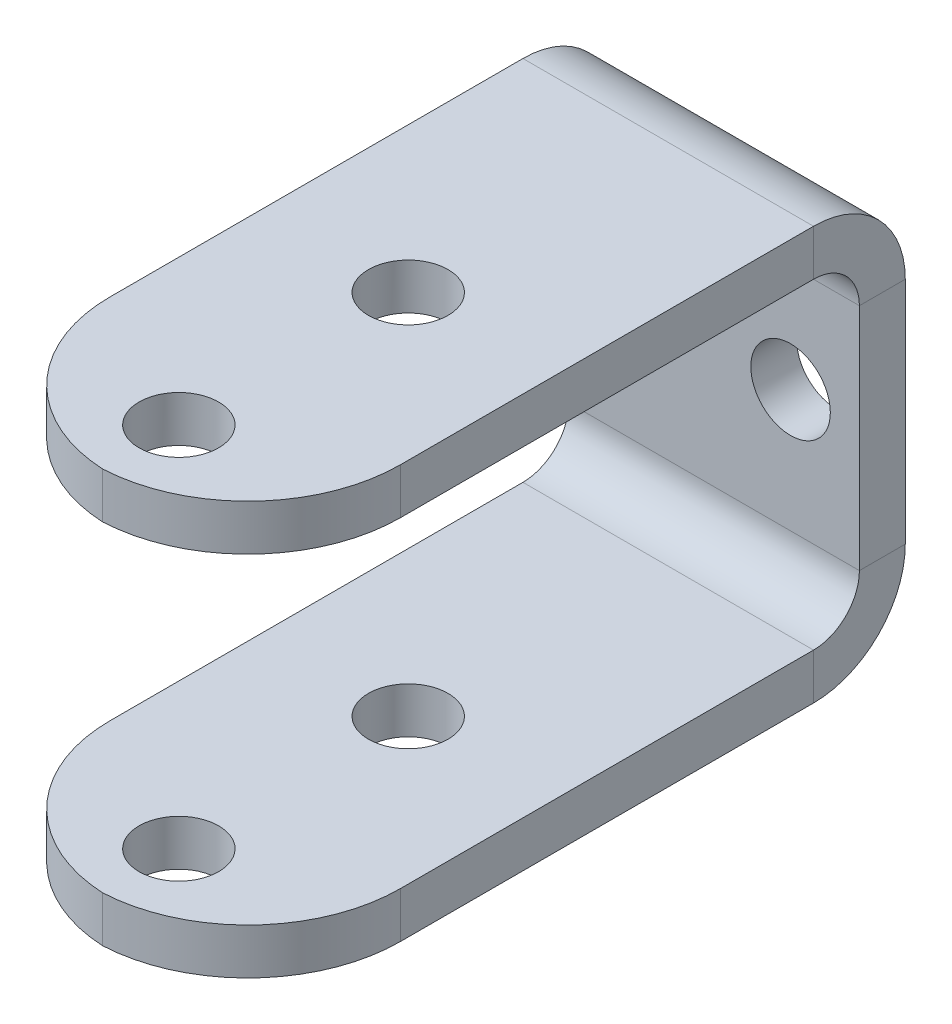
ISO-10303-21;
HEADER;
FILE_DESCRIPTION(('STEP AP214'),'2;1');
FILE_NAME('part.step','',(''),(''),'','','');
FILE_SCHEMA(('AUTOMOTIVE_DESIGN { 1 0 10303 214 1 1 1 1 }'));
ENDSEC;
DATA;
#1=APPLICATION_CONTEXT('core data for automotive mechanical design processes');
#2=APPLICATION_PROTOCOL_DEFINITION('international standard','automotive_design',2000,#1);
#3=PRODUCT_CONTEXT('',#1,'mechanical');
#4=PRODUCT('Part','Part','',(#3));
#5=PRODUCT_RELATED_PRODUCT_CATEGORY('part','',(#4));
#6=PRODUCT_DEFINITION_FORMATION('','',#4);
#7=PRODUCT_DEFINITION_CONTEXT('part definition',#1,'design');
#8=PRODUCT_DEFINITION('design','',#6,#7);
#9=PRODUCT_DEFINITION_SHAPE('','',#8);
#10=(LENGTH_UNIT() NAMED_UNIT(*) SI_UNIT(.MILLI.,.METRE.));
#11=(NAMED_UNIT(*) PLANE_ANGLE_UNIT() SI_UNIT($,.RADIAN.));
#12=(NAMED_UNIT(*) SI_UNIT($,.STERADIAN.) SOLID_ANGLE_UNIT());
#13=UNCERTAINTY_MEASURE_WITH_UNIT(LENGTH_MEASURE(1.E-05),#10,'distance_accuracy_value','');
#14=(GEOMETRIC_REPRESENTATION_CONTEXT(3) GLOBAL_UNCERTAINTY_ASSIGNED_CONTEXT((#13)) GLOBAL_UNIT_ASSIGNED_CONTEXT((#10,
#11,#12)) REPRESENTATION_CONTEXT('',''));
#15=CARTESIAN_POINT('',(0.,0.,0.));
#16=DIRECTION('',(0.,0.,1.));
#17=DIRECTION('',(1.,0.,0.));
#18=AXIS2_PLACEMENT_3D('',#15,#16,#17);
#19=CARTESIAN_POINT('',(0.,0.,-3.));
#20=DIRECTION('',(0.,0.,-1.));
#21=DIRECTION('',(-1.,0.,0.));
#22=AXIS2_PLACEMENT_3D('',#19,#20,#21);
#23=PLANE('',#22);
#24=CARTESIAN_POINT('',(5.,0.50000000000001,-3.));
#25=DIRECTION('',(0.,0.,-1.));
#26=DIRECTION('',(-1.,0.,0.));
#27=AXIS2_PLACEMENT_3D('',#24,#25,#26);
#28=CIRCLE('',#27,2.6);
#29=CARTESIAN_POINT('',(2.4,0.50000000000001,-3.));
#30=VERTEX_POINT('',#29);
#31=EDGE_CURVE('E220',#30,#30,#28,.T.);
#32=ORIENTED_EDGE('',*,*,#31,.F.);
#33=EDGE_LOOP('',(#32));
#34=FACE_BOUND('',#33,.T.);
#35=CARTESIAN_POINT('',(-5.,0.500000000000009,-3.));
#36=DIRECTION('',(0.,0.,-1.));
#37=DIRECTION('',(-1.,0.,0.));
#38=AXIS2_PLACEMENT_3D('',#35,#36,#37);
#39=CIRCLE('',#38,2.6);
#40=CARTESIAN_POINT('',(-7.6,0.500000000000009,-3.));
#41=VERTEX_POINT('',#40);
#42=EDGE_CURVE('E725',#41,#41,#39,.T.);
#43=ORIENTED_EDGE('',*,*,#42,.F.);
#44=EDGE_LOOP('',(#43));
#45=FACE_BOUND('',#44,.T.);
#46=DIRECTION('',(0.,1.,0.));
#47=VECTOR('',#46,1.);
#48=CARTESIAN_POINT('',(9.5,-13.5,-3.));
#49=LINE('',#48,#47);
#50=CARTESIAN_POINT('',(9.5,-7.50000000000001,-3.));
#51=VERTEX_POINT('',#50);
#52=CARTESIAN_POINT('',(9.5,7.50000000000001,-3.));
#53=VERTEX_POINT('',#52);
#54=EDGE_CURVE('E284',#51,#53,#49,.T.);
#55=ORIENTED_EDGE('',*,*,#54,.F.);
#56=DIRECTION('',(1.,0.,0.));
#57=VECTOR('',#56,1.);
#58=CARTESIAN_POINT('',(9.5,-7.50000000000001,-3.));
#59=LINE('',#58,#57);
#60=CARTESIAN_POINT('',(-9.5,-7.49999999999999,-3.));
#61=VERTEX_POINT('',#60);
#62=EDGE_CURVE('E186',#51,#61,#59,.F.);
#63=ORIENTED_EDGE('',*,*,#62,.T.);
#64=DIRECTION('',(0.,-1.,0.));
#65=VECTOR('',#64,1.);
#66=CARTESIAN_POINT('',(-9.5,-13.5,-3.));
#67=LINE('',#66,#65);
#68=CARTESIAN_POINT('',(-9.5,7.50000000000001,-3.));
#69=VERTEX_POINT('',#68);
#70=EDGE_CURVE('E287',#69,#61,#67,.T.);
#71=ORIENTED_EDGE('',*,*,#70,.F.);
#72=DIRECTION('',(-1.,0.,0.));
#73=VECTOR('',#72,1.);
#74=CARTESIAN_POINT('',(-9.5,7.50000000000001,-3.));
#75=LINE('',#74,#73);
#76=EDGE_CURVE('E261',#69,#53,#75,.F.);
#77=ORIENTED_EDGE('',*,*,#76,.T.);
#78=EDGE_LOOP('',(#55,#63,#71,#77));
#79=FACE_BOUND('',#78,.T.);
#80=ADVANCED_FACE('F79',(#34,#45,#79),#23,.T.);
#81=CARTESIAN_POINT('',(0.,0.,0.));
#82=DIRECTION('',(0.,0.,-1.));
#83=DIRECTION('',(-1.,0.,0.));
#84=AXIS2_PLACEMENT_3D('',#81,#82,#83);
#85=PLANE('',#84);
#86=CARTESIAN_POINT('',(5.,0.50000000000001,0.));
#87=DIRECTION('',(0.,0.,1.));
#88=DIRECTION('',(1.,0.,0.));
#89=AXIS2_PLACEMENT_3D('',#86,#87,#88);
#90=CIRCLE('',#89,2.6);
#91=CARTESIAN_POINT('',(7.6,0.50000000000001,0.));
#92=VERTEX_POINT('',#91);
#93=EDGE_CURVE('E722',#92,#92,#90,.T.);
#94=ORIENTED_EDGE('',*,*,#93,.F.);
#95=EDGE_LOOP('',(#94));
#96=FACE_BOUND('',#95,.T.);
#97=CARTESIAN_POINT('',(-5.,0.500000000000009,0.));
#98=DIRECTION('',(0.,0.,1.));
#99=DIRECTION('',(1.,0.,0.));
#100=AXIS2_PLACEMENT_3D('',#97,#98,#99);
#101=CIRCLE('',#100,2.6);
#102=CARTESIAN_POINT('',(-2.4,0.500000000000009,0.));
#103=VERTEX_POINT('',#102);
#104=EDGE_CURVE('E721',#103,#103,#101,.T.);
#105=ORIENTED_EDGE('',*,*,#104,.F.);
#106=EDGE_LOOP('',(#105));
#107=FACE_BOUND('',#106,.T.);
#108=DIRECTION('',(1.,0.,0.));
#109=VECTOR('',#108,1.);
#110=CARTESIAN_POINT('',(9.5,-7.50000000000001,0.));
#111=LINE('',#110,#109);
#112=CARTESIAN_POINT('',(9.5,-7.50000000000001,0.));
#113=VERTEX_POINT('',#112);
#114=CARTESIAN_POINT('',(-9.5,-7.50000000000001,0.));
#115=VERTEX_POINT('',#114);
#116=EDGE_CURVE('E215',#113,#115,#111,.F.);
#117=ORIENTED_EDGE('',*,*,#116,.F.);
#118=DIRECTION('',(0.,1.,0.));
#119=VECTOR('',#118,1.);
#120=CARTESIAN_POINT('',(9.5,-13.5,0.));
#121=LINE('',#120,#119);
#122=CARTESIAN_POINT('',(9.5,7.50000000000001,0.));
#123=VERTEX_POINT('',#122);
#124=EDGE_CURVE('E281',#113,#123,#121,.T.);
#125=ORIENTED_EDGE('',*,*,#124,.T.);
#126=DIRECTION('',(-1.,0.,0.));
#127=VECTOR('',#126,1.);
#128=CARTESIAN_POINT('',(-9.5,7.50000000000001,0.));
#129=LINE('',#128,#127);
#130=CARTESIAN_POINT('',(-9.5,7.50000000000001,0.));
#131=VERTEX_POINT('',#130);
#132=EDGE_CURVE('E274',#131,#123,#129,.F.);
#133=ORIENTED_EDGE('',*,*,#132,.F.);
#134=DIRECTION('',(0.,-1.,0.));
#135=VECTOR('',#134,1.);
#136=CARTESIAN_POINT('',(-9.5,-13.5,0.));
#137=LINE('',#136,#135);
#138=EDGE_CURVE('E288',#131,#115,#137,.T.);
#139=ORIENTED_EDGE('',*,*,#138,.T.);
#140=EDGE_LOOP('',(#117,#125,#133,#139));
#141=FACE_BOUND('',#140,.T.);
#142=ADVANCED_FACE('F380',(#96,#107,#141),#85,.F.);
#143=CARTESIAN_POINT('',(9.5,-13.5,-3.));
#144=DIRECTION('',(1.,0.,0.));
#145=DIRECTION('',(0.,0.,-1.));
#146=AXIS2_PLACEMENT_3D('',#143,#144,#145);
#147=PLANE('',#146);
#148=ORIENTED_EDGE('',*,*,#124,.F.);
#149=DIRECTION('',(0.,0.,-1.));
#150=VECTOR('',#149,1.);
#151=CARTESIAN_POINT('',(9.5,-7.50000000000001,0.));
#152=LINE('',#151,#150);
#153=EDGE_CURVE('E231',#113,#51,#152,.T.);
#154=ORIENTED_EDGE('',*,*,#153,.T.);
#155=ORIENTED_EDGE('',*,*,#54,.T.);
#156=DIRECTION('',(0.,0.,-1.));
#157=VECTOR('',#156,1.);
#158=CARTESIAN_POINT('',(9.5,7.50000000000001,0.));
#159=LINE('',#158,#157);
#160=EDGE_CURVE('E278',#123,#53,#159,.T.);
#161=ORIENTED_EDGE('',*,*,#160,.F.);
#162=EDGE_LOOP('',(#148,#154,#155,#161));
#163=FACE_BOUND('',#162,.T.);
#164=ADVANCED_FACE('F371',(#163),#147,.T.);
#165=CARTESIAN_POINT('',(-9.5,-13.5,-3.));
#166=DIRECTION('',(-1.,0.,0.));
#167=DIRECTION('',(0.,0.,1.));
#168=AXIS2_PLACEMENT_3D('',#165,#166,#167);
#169=PLANE('',#168);
#170=DIRECTION('',(0.,0.,-1.));
#171=VECTOR('',#170,1.);
#172=CARTESIAN_POINT('',(-9.5,-7.50000000000001,0.));
#173=LINE('',#172,#171);
#174=EDGE_CURVE('E236',#115,#61,#173,.T.);
#175=ORIENTED_EDGE('',*,*,#174,.F.);
#176=ORIENTED_EDGE('',*,*,#138,.F.);
#177=DIRECTION('',(0.,0.,-1.));
#178=VECTOR('',#177,1.);
#179=CARTESIAN_POINT('',(-9.5,7.50000000000001,0.));
#180=LINE('',#179,#178);
#181=EDGE_CURVE('E268',#131,#69,#180,.T.);
#182=ORIENTED_EDGE('',*,*,#181,.T.);
#183=ORIENTED_EDGE('',*,*,#70,.T.);
#184=EDGE_LOOP('',(#175,#176,#182,#183));
#185=FACE_BOUND('',#184,.T.);
#186=ADVANCED_FACE('F377',(#185),#169,.T.);
#187=CARTESIAN_POINT('',(9.5,7.50000000000001,3.));
#188=DIRECTION('',(1.,0.,0.));
#189=DIRECTION('',(0.,0.,-1.));
#190=AXIS2_PLACEMENT_3D('',#187,#188,#189);
#191=PLANE('',#190);
#192=DIRECTION('',(0.,-1.,0.));
#193=VECTOR('',#192,1.);
#194=CARTESIAN_POINT('',(9.5,13.5,2.99999999999998));
#195=LINE('',#194,#193);
#196=CARTESIAN_POINT('',(9.5,10.5,2.99999999999999));
#197=VERTEX_POINT('',#196);
#198=CARTESIAN_POINT('',(9.5,13.5,2.99999999999998));
#199=VERTEX_POINT('',#198);
#200=EDGE_CURVE('E239',#197,#199,#195,.F.);
#201=ORIENTED_EDGE('',*,*,#200,.F.);
#202=CARTESIAN_POINT('',(9.5,7.50000000000001,3.));
#203=DIRECTION('',(-1.,0.,0.));
#204=DIRECTION('',(0.,0.,1.));
#205=AXIS2_PLACEMENT_3D('',#202,#203,#204);
#206=CIRCLE('',#205,3.);
#207=EDGE_CURVE('E271',#123,#197,#206,.F.);
#208=ORIENTED_EDGE('',*,*,#207,.F.);
#209=ORIENTED_EDGE('',*,*,#160,.T.);
#210=CARTESIAN_POINT('',(9.5,7.50000000000001,3.));
#211=DIRECTION('',(-1.,0.,0.));
#212=DIRECTION('',(0.,0.,1.));
#213=AXIS2_PLACEMENT_3D('',#210,#211,#212);
#214=CIRCLE('',#213,6.);
#215=EDGE_CURVE('E264',#53,#199,#214,.F.);
#216=ORIENTED_EDGE('',*,*,#215,.T.);
#217=EDGE_LOOP('',(#201,#208,#209,#216));
#218=FACE_BOUND('',#217,.T.);
#219=ADVANCED_FACE('F366',(#218),#191,.T.);
#220=CARTESIAN_POINT('',(-9.5,7.50000000000001,3.));
#221=DIRECTION('',(1.,0.,0.));
#222=DIRECTION('',(0.,0.,-1.));
#223=AXIS2_PLACEMENT_3D('',#220,#221,#222);
#224=PLANE('',#223);
#225=CARTESIAN_POINT('',(-9.5,7.50000000000001,3.));
#226=DIRECTION('',(-1.,0.,0.));
#227=DIRECTION('',(0.,0.,1.));
#228=AXIS2_PLACEMENT_3D('',#225,#226,#227);
#229=CIRCLE('',#228,3.);
#230=CARTESIAN_POINT('',(-9.5,10.5,2.99999999999999));
#231=VERTEX_POINT('',#230);
#232=EDGE_CURVE('E243',#231,#131,#229,.T.);
#233=ORIENTED_EDGE('',*,*,#232,.F.);
#234=DIRECTION('',(0.,-1.,0.));
#235=VECTOR('',#234,1.);
#236=CARTESIAN_POINT('',(-9.5,10.5,2.99999999999999));
#237=LINE('',#236,#235);
#238=CARTESIAN_POINT('',(-9.5,13.5,2.99999999999998));
#239=VERTEX_POINT('',#238);
#240=EDGE_CURVE('E254',#231,#239,#237,.F.);
#241=ORIENTED_EDGE('',*,*,#240,.T.);
#242=CARTESIAN_POINT('',(-9.5,7.50000000000001,3.));
#243=DIRECTION('',(-1.,0.,0.));
#244=DIRECTION('',(0.,0.,1.));
#245=AXIS2_PLACEMENT_3D('',#242,#243,#244);
#246=CIRCLE('',#245,6.);
#247=EDGE_CURVE('E265',#239,#69,#246,.T.);
#248=ORIENTED_EDGE('',*,*,#247,.T.);
#249=ORIENTED_EDGE('',*,*,#181,.F.);
#250=EDGE_LOOP('',(#233,#241,#248,#249));
#251=FACE_BOUND('',#250,.T.);
#252=ADVANCED_FACE('F357',(#251),#224,.F.);
#253=CARTESIAN_POINT('',(-9.5,7.50000000000001,3.));
#254=DIRECTION('',(-1.,0.,0.));
#255=DIRECTION('',(0.,1.,0.));
#256=AXIS2_PLACEMENT_3D('',#253,#254,#255);
#257=CYLINDRICAL_SURFACE('',#256,6.);
#258=ORIENTED_EDGE('',*,*,#76,.F.);
#259=ORIENTED_EDGE('',*,*,#247,.F.);
#260=DIRECTION('',(-1.,0.,0.));
#261=VECTOR('',#260,1.);
#262=CARTESIAN_POINT('',(9.5,13.5,2.99999999999998));
#263=LINE('',#262,#261);
#264=EDGE_CURVE('E251',#239,#199,#263,.F.);
#265=ORIENTED_EDGE('',*,*,#264,.T.);
#266=ORIENTED_EDGE('',*,*,#215,.F.);
#267=EDGE_LOOP('',(#258,#259,#265,#266));
#268=FACE_BOUND('',#267,.T.);
#269=ADVANCED_FACE('F364',(#268),#257,.T.);
#270=CARTESIAN_POINT('',(-9.5,7.50000000000001,3.));
#271=DIRECTION('',(-1.,0.,0.));
#272=DIRECTION('',(0.,1.,0.));
#273=AXIS2_PLACEMENT_3D('',#270,#271,#272);
#274=CYLINDRICAL_SURFACE('',#273,3.);
#275=ORIENTED_EDGE('',*,*,#132,.T.);
#276=ORIENTED_EDGE('',*,*,#207,.T.);
#277=DIRECTION('',(-1.,0.,0.));
#278=VECTOR('',#277,1.);
#279=CARTESIAN_POINT('',(9.5,10.5,2.99999999999999));
#280=LINE('',#279,#278);
#281=EDGE_CURVE('E257',#197,#231,#280,.T.);
#282=ORIENTED_EDGE('',*,*,#281,.T.);
#283=ORIENTED_EDGE('',*,*,#232,.T.);
#284=EDGE_LOOP('',(#275,#276,#282,#283));
#285=FACE_BOUND('',#284,.T.);
#286=ADVANCED_FACE('F352',(#285),#274,.F.);
#287=CARTESIAN_POINT('',(9.5,13.5,0.));
#288=DIRECTION('',(-1.,0.,0.));
#289=DIRECTION('',(0.,0.,1.));
#290=AXIS2_PLACEMENT_3D('',#287,#288,#289);
#291=PLANE('',#290);
#292=DIRECTION('',(0.,0.,-1.));
#293=VECTOR('',#292,1.);
#294=CARTESIAN_POINT('',(9.5,13.5,0.));
#295=LINE('',#294,#293);
#296=CARTESIAN_POINT('',(9.5,13.5000000000001,30.));
#297=VERTEX_POINT('',#296);
#298=EDGE_CURVE('E244',#297,#199,#295,.T.);
#299=ORIENTED_EDGE('',*,*,#298,.F.);
#300=DIRECTION('',(0.,-1.,0.));
#301=VECTOR('',#300,1.);
#302=CARTESIAN_POINT('',(9.5,13.5000000000001,30.));
#303=LINE('',#302,#301);
#304=CARTESIAN_POINT('',(9.5,10.5000000000001,30.));
#305=VERTEX_POINT('',#304);
#306=EDGE_CURVE('E13',#297,#305,#303,.T.);
#307=ORIENTED_EDGE('',*,*,#306,.T.);
#308=DIRECTION('',(0.,0.,1.));
#309=VECTOR('',#308,1.);
#310=CARTESIAN_POINT('',(9.5,10.5,0.));
#311=LINE('',#310,#309);
#312=EDGE_CURVE('E249',#305,#197,#311,.F.);
#313=ORIENTED_EDGE('',*,*,#312,.T.);
#314=ORIENTED_EDGE('',*,*,#200,.T.);
#315=EDGE_LOOP('',(#299,#307,#313,#314));
#316=FACE_BOUND('',#315,.T.);
#317=ADVANCED_FACE('F344',(#316),#291,.F.);
#318=CARTESIAN_POINT('',(-9.49999999999999,13.5000000000001,40.));
#319=DIRECTION('',(1.,0.,0.));
#320=DIRECTION('',(0.,0.,-1.));
#321=AXIS2_PLACEMENT_3D('',#318,#319,#320);
#322=PLANE('',#321);
#323=DIRECTION('',(0.,0.,-1.));
#324=VECTOR('',#323,1.);
#325=CARTESIAN_POINT('',(-9.49999999999999,10.5000000000001,40.));
#326=LINE('',#325,#324);
#327=CARTESIAN_POINT('',(-9.49999999999999,10.5000000000001,30.));
#328=VERTEX_POINT('',#327);
#329=EDGE_CURVE('E246',#231,#328,#326,.F.);
#330=ORIENTED_EDGE('',*,*,#329,.T.);
#331=DIRECTION('',(0.,-1.,0.));
#332=VECTOR('',#331,1.);
#333=CARTESIAN_POINT('',(-9.49999999999999,13.5000000000001,30.));
#334=LINE('',#333,#332);
#335=CARTESIAN_POINT('',(-9.49999999999999,13.5000000000001,30.));
#336=VERTEX_POINT('',#335);
#337=EDGE_CURVE('E319',#328,#336,#334,.F.);
#338=ORIENTED_EDGE('',*,*,#337,.T.);
#339=DIRECTION('',(0.,0.,1.));
#340=VECTOR('',#339,1.);
#341=CARTESIAN_POINT('',(-9.5,13.5,0.));
#342=LINE('',#341,#340);
#343=EDGE_CURVE('E241',#239,#336,#342,.T.);
#344=ORIENTED_EDGE('',*,*,#343,.F.);
#345=ORIENTED_EDGE('',*,*,#240,.F.);
#346=EDGE_LOOP('',(#330,#338,#344,#345));
#347=FACE_BOUND('',#346,.T.);
#348=ADVANCED_FACE('F361',(#347),#322,.F.);
#349=CARTESIAN_POINT('',(0.,13.5,0.));
#350=DIRECTION('',(0.,-1.,0.));
#351=DIRECTION('',(0.,0.,-1.));
#352=AXIS2_PLACEMENT_3D('',#349,#350,#351);
#353=PLANE('',#352);
#354=CARTESIAN_POINT('',(0.,13.5000000000001,35.));
#355=DIRECTION('',(0.,1.,0.));
#356=DIRECTION('',(0.,0.,1.));
#357=AXIS2_PLACEMENT_3D('',#354,#355,#356);
#358=CIRCLE('',#357,2.6);
#359=CARTESIAN_POINT('',(0.,13.5000000000001,37.6));
#360=VERTEX_POINT('',#359);
#361=EDGE_CURVE('E711',#360,#360,#358,.T.);
#362=ORIENTED_EDGE('',*,*,#361,.F.);
#363=EDGE_LOOP('',(#362));
#364=FACE_BOUND('',#363,.T.);
#365=CARTESIAN_POINT('',(0.,13.5000000000001,20.));
#366=DIRECTION('',(0.,1.,0.));
#367=DIRECTION('',(0.,0.,1.));
#368=AXIS2_PLACEMENT_3D('',#365,#366,#367);
#369=CIRCLE('',#368,2.6);
#370=CARTESIAN_POINT('',(0.,13.5000000000001,22.6));
#371=VERTEX_POINT('',#370);
#372=EDGE_CURVE('E326',#371,#371,#369,.T.);
#373=ORIENTED_EDGE('',*,*,#372,.F.);
#374=EDGE_LOOP('',(#373));
#375=FACE_BOUND('',#374,.T.);
#376=ORIENTED_EDGE('',*,*,#343,.T.);
#377=CARTESIAN_POINT('',(0.500000000000006,13.5000000000001,30.));
#378=DIRECTION('',(0.,-1.,0.));
#379=DIRECTION('',(0.,0.,-1.));
#380=AXIS2_PLACEMENT_3D('',#377,#378,#379);
#381=CIRCLE('',#380,10.);
#382=CARTESIAN_POINT('',(0.,13.5000000000001,39.9874921777191));
#383=VERTEX_POINT('',#382);
#384=EDGE_CURVE('E96',#336,#383,#381,.F.);
#385=ORIENTED_EDGE('',*,*,#384,.T.);
#386=CARTESIAN_POINT('',(-0.499999999999998,13.5000000000001,30.));
#387=DIRECTION('',(0.,-1.,0.));
#388=DIRECTION('',(0.,0.,-1.));
#389=AXIS2_PLACEMENT_3D('',#386,#387,#388);
#390=CIRCLE('',#389,10.);
#391=EDGE_CURVE('E100',#383,#297,#390,.F.);
#392=ORIENTED_EDGE('',*,*,#391,.T.);
#393=ORIENTED_EDGE('',*,*,#298,.T.);
#394=ORIENTED_EDGE('',*,*,#264,.F.);
#395=EDGE_LOOP('',(#376,#385,#392,#393,#394));
#396=FACE_BOUND('',#395,.T.);
#397=ADVANCED_FACE('F362',(#364,#375,#396),#353,.F.);
#398=CARTESIAN_POINT('',(0.,10.5,0.));
#399=DIRECTION('',(0.,-1.,0.));
#400=DIRECTION('',(0.,0.,-1.));
#401=AXIS2_PLACEMENT_3D('',#398,#399,#400);
#402=PLANE('',#401);
#403=CARTESIAN_POINT('',(0.,10.5000000000001,35.));
#404=DIRECTION('',(0.,-1.,0.));
#405=DIRECTION('',(0.,0.,-1.));
#406=AXIS2_PLACEMENT_3D('',#403,#404,#405);
#407=CIRCLE('',#406,2.6);
#408=CARTESIAN_POINT('',(0.,10.5000000000001,32.4));
#409=VERTEX_POINT('',#408);
#410=EDGE_CURVE('E304',#409,#409,#407,.T.);
#411=ORIENTED_EDGE('',*,*,#410,.F.);
#412=EDGE_LOOP('',(#411));
#413=FACE_BOUND('',#412,.T.);
#414=CARTESIAN_POINT('',(0.,10.5000000000001,20.));
#415=DIRECTION('',(0.,-1.,0.));
#416=DIRECTION('',(0.,0.,-1.));
#417=AXIS2_PLACEMENT_3D('',#414,#415,#416);
#418=CIRCLE('',#417,2.6);
#419=CARTESIAN_POINT('',(0.,10.5000000000001,17.4));
#420=VERTEX_POINT('',#419);
#421=EDGE_CURVE('E299',#420,#420,#418,.T.);
#422=ORIENTED_EDGE('',*,*,#421,.F.);
#423=EDGE_LOOP('',(#422));
#424=FACE_BOUND('',#423,.T.);
#425=CARTESIAN_POINT('',(-0.499999999999998,10.5000000000001,30.));
#426=DIRECTION('',(0.,-1.,0.));
#427=DIRECTION('',(0.,0.,-1.));
#428=AXIS2_PLACEMENT_3D('',#425,#426,#427);
#429=CIRCLE('',#428,10.);
#430=CARTESIAN_POINT('',(0.,10.5000000000001,39.9874921777191));
#431=VERTEX_POINT('',#430);
#432=EDGE_CURVE('E315',#305,#431,#429,.T.);
#433=ORIENTED_EDGE('',*,*,#432,.T.);
#434=CARTESIAN_POINT('',(0.500000000000006,10.5000000000001,30.));
#435=DIRECTION('',(0.,-1.,0.));
#436=DIRECTION('',(0.,0.,-1.));
#437=AXIS2_PLACEMENT_3D('',#434,#435,#436);
#438=CIRCLE('',#437,10.);
#439=EDGE_CURVE('E317',#431,#328,#438,.T.);
#440=ORIENTED_EDGE('',*,*,#439,.T.);
#441=ORIENTED_EDGE('',*,*,#329,.F.);
#442=ORIENTED_EDGE('',*,*,#281,.F.);
#443=ORIENTED_EDGE('',*,*,#312,.F.);
#444=EDGE_LOOP('',(#433,#440,#441,#442,#443));
#445=FACE_BOUND('',#444,.T.);
#446=ADVANCED_FACE('F348',(#413,#424,#445),#402,.T.);
#447=CARTESIAN_POINT('',(-9.5,-7.50000000000001,3.));
#448=DIRECTION('',(-1.,0.,0.));
#449=DIRECTION('',(0.,0.,1.));
#450=AXIS2_PLACEMENT_3D('',#447,#448,#449);
#451=PLANE('',#450);
#452=DIRECTION('',(0.,1.,0.));
#453=VECTOR('',#452,1.);
#454=CARTESIAN_POINT('',(-9.5,-13.5,2.99999999999998));
#455=LINE('',#454,#453);
#456=CARTESIAN_POINT('',(-9.5,-10.5,2.99999999999999));
#457=VERTEX_POINT('',#456);
#458=CARTESIAN_POINT('',(-9.5,-13.5,2.99999999999998));
#459=VERTEX_POINT('',#458);
#460=EDGE_CURVE('E226',#457,#459,#455,.F.);
#461=ORIENTED_EDGE('',*,*,#460,.F.);
#462=CARTESIAN_POINT('',(-9.5,-7.50000000000001,3.));
#463=DIRECTION('',(1.,0.,0.));
#464=DIRECTION('',(0.,0.,-1.));
#465=AXIS2_PLACEMENT_3D('',#462,#463,#464);
#466=CIRCLE('',#465,3.);
#467=EDGE_CURVE('E189',#115,#457,#466,.F.);
#468=ORIENTED_EDGE('',*,*,#467,.F.);
#469=ORIENTED_EDGE('',*,*,#174,.T.);
#470=CARTESIAN_POINT('',(-9.5,-7.50000000000001,3.));
#471=DIRECTION('',(1.,0.,0.));
#472=DIRECTION('',(0.,0.,-1.));
#473=AXIS2_PLACEMENT_3D('',#470,#471,#472);
#474=CIRCLE('',#473,6.);
#475=EDGE_CURVE('E230',#61,#459,#474,.F.);
#476=ORIENTED_EDGE('',*,*,#475,.T.);
#477=EDGE_LOOP('',(#461,#468,#469,#476));
#478=FACE_BOUND('',#477,.T.);
#479=ADVANCED_FACE('F387',(#478),#451,.T.);
#480=CARTESIAN_POINT('',(9.5,-7.50000000000001,3.));
#481=DIRECTION('',(-1.,0.,0.));
#482=DIRECTION('',(0.,0.,1.));
#483=AXIS2_PLACEMENT_3D('',#480,#481,#482);
#484=PLANE('',#483);
#485=CARTESIAN_POINT('',(9.5,-7.50000000000001,3.));
#486=DIRECTION('',(1.,0.,0.));
#487=DIRECTION('',(0.,0.,-1.));
#488=AXIS2_PLACEMENT_3D('',#485,#486,#487);
#489=CIRCLE('',#488,3.);
#490=CARTESIAN_POINT('',(9.5,-10.5,2.99999999999999));
#491=VERTEX_POINT('',#490);
#492=EDGE_CURVE('E196',#491,#113,#489,.T.);
#493=ORIENTED_EDGE('',*,*,#492,.F.);
#494=DIRECTION('',(0.,1.,0.));
#495=VECTOR('',#494,1.);
#496=CARTESIAN_POINT('',(9.5,-10.5,2.99999999999999));
#497=LINE('',#496,#495);
#498=CARTESIAN_POINT('',(9.5,-13.5,2.99999999999998));
#499=VERTEX_POINT('',#498);
#500=EDGE_CURVE('E193',#491,#499,#497,.F.);
#501=ORIENTED_EDGE('',*,*,#500,.T.);
#502=CARTESIAN_POINT('',(9.5,-7.50000000000001,3.));
#503=DIRECTION('',(1.,0.,0.));
#504=DIRECTION('',(0.,0.,-1.));
#505=AXIS2_PLACEMENT_3D('',#502,#503,#504);
#506=CIRCLE('',#505,6.);
#507=EDGE_CURVE('E179',#499,#51,#506,.T.);
#508=ORIENTED_EDGE('',*,*,#507,.T.);
#509=ORIENTED_EDGE('',*,*,#153,.F.);
#510=EDGE_LOOP('',(#493,#501,#508,#509));
#511=FACE_BOUND('',#510,.T.);
#512=ADVANCED_FACE('F194',(#511),#484,.F.);
#513=CARTESIAN_POINT('',(9.5,-7.50000000000001,3.));
#514=DIRECTION('',(1.,0.,0.));
#515=DIRECTION('',(0.,-1.,0.));
#516=AXIS2_PLACEMENT_3D('',#513,#514,#515);
#517=CYLINDRICAL_SURFACE('',#516,6.);
#518=ORIENTED_EDGE('',*,*,#62,.F.);
#519=ORIENTED_EDGE('',*,*,#507,.F.);
#520=DIRECTION('',(1.,0.,0.));
#521=VECTOR('',#520,1.);
#522=CARTESIAN_POINT('',(-9.5,-13.5,2.99999999999998));
#523=LINE('',#522,#521);
#524=EDGE_CURVE('E183',#499,#459,#523,.F.);
#525=ORIENTED_EDGE('',*,*,#524,.T.);
#526=ORIENTED_EDGE('',*,*,#475,.F.);
#527=EDGE_LOOP('',(#518,#519,#525,#526));
#528=FACE_BOUND('',#527,.T.);
#529=ADVANCED_FACE('F181',(#528),#517,.T.);
#530=CARTESIAN_POINT('',(9.5,-7.50000000000001,3.));
#531=DIRECTION('',(1.,0.,0.));
#532=DIRECTION('',(0.,-1.,0.));
#533=AXIS2_PLACEMENT_3D('',#530,#531,#532);
#534=CYLINDRICAL_SURFACE('',#533,3.);
#535=ORIENTED_EDGE('',*,*,#116,.T.);
#536=ORIENTED_EDGE('',*,*,#467,.T.);
#537=DIRECTION('',(1.,0.,0.));
#538=VECTOR('',#537,1.);
#539=CARTESIAN_POINT('',(-9.5,-10.5,2.99999999999999));
#540=LINE('',#539,#538);
#541=EDGE_CURVE('E201',#457,#491,#540,.T.);
#542=ORIENTED_EDGE('',*,*,#541,.T.);
#543=ORIENTED_EDGE('',*,*,#492,.T.);
#544=EDGE_LOOP('',(#535,#536,#542,#543));
#545=FACE_BOUND('',#544,.T.);
#546=ADVANCED_FACE('F383',(#545),#534,.F.);
#547=CARTESIAN_POINT('',(-9.5,-13.5,0.));
#548=DIRECTION('',(1.,0.,0.));
#549=DIRECTION('',(0.,0.,-1.));
#550=AXIS2_PLACEMENT_3D('',#547,#548,#549);
#551=PLANE('',#550);
#552=DIRECTION('',(0.,0.,-1.));
#553=VECTOR('',#552,1.);
#554=CARTESIAN_POINT('',(-9.5,-13.5,0.));
#555=LINE('',#554,#553);
#556=CARTESIAN_POINT('',(-9.5,-13.5000000000001,30.));
#557=VERTEX_POINT('',#556);
#558=EDGE_CURVE('E209',#557,#459,#555,.T.);
#559=ORIENTED_EDGE('',*,*,#558,.F.);
#560=DIRECTION('',(0.,1.,0.));
#561=VECTOR('',#560,1.);
#562=CARTESIAN_POINT('',(-9.5,-13.5000000000001,30.));
#563=LINE('',#562,#561);
#564=CARTESIAN_POINT('',(-9.5,-10.5000000000001,30.));
#565=VERTEX_POINT('',#564);
#566=EDGE_CURVE('E291',#557,#565,#563,.T.);
#567=ORIENTED_EDGE('',*,*,#566,.T.);
#568=DIRECTION('',(0.,0.,1.));
#569=VECTOR('',#568,1.);
#570=CARTESIAN_POINT('',(-9.5,-10.5,0.));
#571=LINE('',#570,#569);
#572=EDGE_CURVE('E210',#565,#457,#571,.F.);
#573=ORIENTED_EDGE('',*,*,#572,.T.);
#574=ORIENTED_EDGE('',*,*,#460,.T.);
#575=EDGE_LOOP('',(#559,#567,#573,#574));
#576=FACE_BOUND('',#575,.T.);
#577=ADVANCED_FACE('F389',(#576),#551,.F.);
#578=CARTESIAN_POINT('',(9.5,-13.5000000000001,40.));
#579=DIRECTION('',(-1.,0.,0.));
#580=DIRECTION('',(0.,0.,1.));
#581=AXIS2_PLACEMENT_3D('',#578,#579,#580);
#582=PLANE('',#581);
#583=DIRECTION('',(0.,0.,-1.));
#584=VECTOR('',#583,1.);
#585=CARTESIAN_POINT('',(9.5,-10.5000000000001,40.));
#586=LINE('',#585,#584);
#587=CARTESIAN_POINT('',(9.5,-10.5000000000001,30.));
#588=VERTEX_POINT('',#587);
#589=EDGE_CURVE('E217',#491,#588,#586,.F.);
#590=ORIENTED_EDGE('',*,*,#589,.T.);
#591=DIRECTION('',(0.,1.,0.));
#592=VECTOR('',#591,1.);
#593=CARTESIAN_POINT('',(9.5,-13.5000000000001,30.));
#594=LINE('',#593,#592);
#595=CARTESIAN_POINT('',(9.5,-13.5000000000001,30.));
#596=VERTEX_POINT('',#595);
#597=EDGE_CURVE('E88',#588,#596,#594,.F.);
#598=ORIENTED_EDGE('',*,*,#597,.T.);
#599=DIRECTION('',(0.,0.,1.));
#600=VECTOR('',#599,1.);
#601=CARTESIAN_POINT('',(9.5,-13.5,0.));
#602=LINE('',#601,#600);
#603=EDGE_CURVE('E206',#499,#596,#602,.T.);
#604=ORIENTED_EDGE('',*,*,#603,.F.);
#605=ORIENTED_EDGE('',*,*,#500,.F.);
#606=EDGE_LOOP('',(#590,#598,#604,#605));
#607=FACE_BOUND('',#606,.T.);
#608=ADVANCED_FACE('F212',(#607),#582,.F.);
#609=CARTESIAN_POINT('',(0.,-13.5,0.));
#610=DIRECTION('',(0.,1.,0.));
#611=DIRECTION('',(0.,0.,1.));
#612=AXIS2_PLACEMENT_3D('',#609,#610,#611);
#613=PLANE('',#612);
#614=CARTESIAN_POINT('',(0.,-13.5000000000002,35.0000000000001));
#615=DIRECTION('',(0.,1.,0.));
#616=DIRECTION('',(0.,0.,1.));
#617=AXIS2_PLACEMENT_3D('',#614,#615,#616);
#618=CIRCLE('',#617,2.6);
#619=CARTESIAN_POINT('',(0.,-13.5000000000001,37.6000000000001));
#620=VERTEX_POINT('',#619);
#621=EDGE_CURVE('E300',#620,#620,#618,.T.);
#622=ORIENTED_EDGE('',*,*,#621,.T.);
#623=EDGE_LOOP('',(#622));
#624=FACE_BOUND('',#623,.T.);
#625=CARTESIAN_POINT('',(0.,-13.5000000000002,20.0000000000001));
#626=DIRECTION('',(0.,1.,0.));
#627=DIRECTION('',(0.,0.,1.));
#628=AXIS2_PLACEMENT_3D('',#625,#626,#627);
#629=CIRCLE('',#628,2.6);
#630=CARTESIAN_POINT('',(0.,-13.5000000000002,22.6000000000001));
#631=VERTEX_POINT('',#630);
#632=EDGE_CURVE('E331',#631,#631,#629,.T.);
#633=ORIENTED_EDGE('',*,*,#632,.T.);
#634=EDGE_LOOP('',(#633));
#635=FACE_BOUND('',#634,.T.);
#636=CARTESIAN_POINT('',(-0.500000000000002,-13.5000000000001,30.));
#637=DIRECTION('',(0.,1.,0.));
#638=DIRECTION('',(0.,0.,1.));
#639=AXIS2_PLACEMENT_3D('',#636,#637,#638);
#640=CIRCLE('',#639,10.);
#641=CARTESIAN_POINT('',(0.,-13.5000000000001,39.9874921777191));
#642=VERTEX_POINT('',#641);
#643=EDGE_CURVE('E311',#596,#642,#640,.F.);
#644=ORIENTED_EDGE('',*,*,#643,.T.);
#645=CARTESIAN_POINT('',(0.500000000000003,-13.5000000000001,30.));
#646=DIRECTION('',(0.,1.,0.));
#647=DIRECTION('',(0.,0.,1.));
#648=AXIS2_PLACEMENT_3D('',#645,#646,#647);
#649=CIRCLE('',#648,10.);
#650=EDGE_CURVE('E313',#642,#557,#649,.F.);
#651=ORIENTED_EDGE('',*,*,#650,.T.);
#652=ORIENTED_EDGE('',*,*,#558,.T.);
#653=ORIENTED_EDGE('',*,*,#524,.F.);
#654=ORIENTED_EDGE('',*,*,#603,.T.);
#655=EDGE_LOOP('',(#644,#651,#652,#653,#654));
#656=FACE_BOUND('',#655,.T.);
#657=ADVANCED_FACE('F205',(#624,#635,#656),#613,.F.);
#658=CARTESIAN_POINT('',(0.,-10.5,0.));
#659=DIRECTION('',(0.,1.,0.));
#660=DIRECTION('',(0.,0.,1.));
#661=AXIS2_PLACEMENT_3D('',#658,#659,#660);
#662=PLANE('',#661);
#663=CARTESIAN_POINT('',(0.,-10.5000000000001,35.0000000000001));
#664=DIRECTION('',(0.,1.,0.));
#665=DIRECTION('',(0.,0.,1.));
#666=AXIS2_PLACEMENT_3D('',#663,#664,#665);
#667=CIRCLE('',#666,2.6);
#668=CARTESIAN_POINT('',(0.,-10.5000000000001,37.6000000000001));
#669=VERTEX_POINT('',#668);
#670=EDGE_CURVE('E301',#669,#669,#667,.T.);
#671=ORIENTED_EDGE('',*,*,#670,.F.);
#672=EDGE_LOOP('',(#671));
#673=FACE_BOUND('',#672,.T.);
#674=CARTESIAN_POINT('',(0.,-10.5000000000001,20.0000000000001));
#675=DIRECTION('',(0.,1.,0.));
#676=DIRECTION('',(0.,0.,1.));
#677=AXIS2_PLACEMENT_3D('',#674,#675,#676);
#678=CIRCLE('',#677,2.6);
#679=CARTESIAN_POINT('',(0.,-10.5000000000001,22.6000000000001));
#680=VERTEX_POINT('',#679);
#681=EDGE_CURVE('E296',#680,#680,#678,.T.);
#682=ORIENTED_EDGE('',*,*,#681,.F.);
#683=EDGE_LOOP('',(#682));
#684=FACE_BOUND('',#683,.T.);
#685=ORIENTED_EDGE('',*,*,#572,.F.);
#686=CARTESIAN_POINT('',(0.500000000000003,-10.5000000000001,30.));
#687=DIRECTION('',(0.,1.,0.));
#688=DIRECTION('',(0.,0.,1.));
#689=AXIS2_PLACEMENT_3D('',#686,#687,#688);
#690=CIRCLE('',#689,10.);
#691=CARTESIAN_POINT('',(0.,-10.5000000000001,39.9874921777191));
#692=VERTEX_POINT('',#691);
#693=EDGE_CURVE('E309',#565,#692,#690,.T.);
#694=ORIENTED_EDGE('',*,*,#693,.T.);
#695=CARTESIAN_POINT('',(-0.500000000000002,-10.5000000000001,30.));
#696=DIRECTION('',(0.,1.,0.));
#697=DIRECTION('',(0.,0.,1.));
#698=AXIS2_PLACEMENT_3D('',#695,#696,#697);
#699=CIRCLE('',#698,10.);
#700=EDGE_CURVE('E307',#692,#588,#699,.T.);
#701=ORIENTED_EDGE('',*,*,#700,.T.);
#702=ORIENTED_EDGE('',*,*,#589,.F.);
#703=ORIENTED_EDGE('',*,*,#541,.F.);
#704=EDGE_LOOP('',(#685,#694,#701,#702,#703));
#705=FACE_BOUND('',#704,.T.);
#706=ADVANCED_FACE('F393',(#673,#684,#705),#662,.T.);
#707=CARTESIAN_POINT('',(-5.,0.500000000000009,-10.));
#708=DIRECTION('',(0.,0.,1.));
#709=DIRECTION('',(1.,0.,0.));
#710=AXIS2_PLACEMENT_3D('',#707,#708,#709);
#711=CYLINDRICAL_SURFACE('',#710,2.6);
#712=ORIENTED_EDGE('',*,*,#42,.T.);
#713=EDGE_LOOP('',(#712));
#714=FACE_BOUND('',#713,.T.);
#715=ORIENTED_EDGE('',*,*,#104,.T.);
#716=EDGE_LOOP('',(#715));
#717=FACE_BOUND('',#716,.T.);
#718=ADVANCED_FACE('F528',(#714,#717),#711,.F.);
#719=CARTESIAN_POINT('',(5.,0.50000000000001,-10.));
#720=DIRECTION('',(0.,0.,1.));
#721=DIRECTION('',(1.,0.,0.));
#722=AXIS2_PLACEMENT_3D('',#719,#720,#721);
#723=CYLINDRICAL_SURFACE('',#722,2.6);
#724=ORIENTED_EDGE('',*,*,#31,.T.);
#725=EDGE_LOOP('',(#724));
#726=FACE_BOUND('',#725,.T.);
#727=ORIENTED_EDGE('',*,*,#93,.T.);
#728=EDGE_LOOP('',(#727));
#729=FACE_BOUND('',#728,.T.);
#730=ADVANCED_FACE('F537',(#726,#729),#723,.F.);
#731=CARTESIAN_POINT('',(0.,-13.5000000000002,20.0000000000001));
#732=DIRECTION('',(0.,1.,0.));
#733=DIRECTION('',(0.,0.,1.));
#734=AXIS2_PLACEMENT_3D('',#731,#732,#733);
#735=CYLINDRICAL_SURFACE('',#734,2.6);
#736=ORIENTED_EDGE('',*,*,#681,.T.);
#737=EDGE_LOOP('',(#736));
#738=FACE_BOUND('',#737,.T.);
#739=ORIENTED_EDGE('',*,*,#632,.F.);
#740=EDGE_LOOP('',(#739));
#741=FACE_BOUND('',#740,.T.);
#742=ADVANCED_FACE('F545',(#738,#741),#735,.F.);
#743=CARTESIAN_POINT('',(0.,-13.5000000000002,35.0000000000001));
#744=DIRECTION('',(0.,1.,0.));
#745=DIRECTION('',(0.,0.,1.));
#746=AXIS2_PLACEMENT_3D('',#743,#744,#745);
#747=CYLINDRICAL_SURFACE('',#746,2.6);
#748=ORIENTED_EDGE('',*,*,#670,.T.);
#749=EDGE_LOOP('',(#748));
#750=FACE_BOUND('',#749,.T.);
#751=ORIENTED_EDGE('',*,*,#621,.F.);
#752=EDGE_LOOP('',(#751));
#753=FACE_BOUND('',#752,.T.);
#754=ADVANCED_FACE('F553',(#750,#753),#747,.F.);
#755=ORIENTED_EDGE('',*,*,#421,.T.);
#756=EDGE_LOOP('',(#755));
#757=FACE_BOUND('',#756,.T.);
#758=ORIENTED_EDGE('',*,*,#372,.T.);
#759=EDGE_LOOP('',(#758));
#760=FACE_BOUND('',#759,.T.);
#761=ADVANCED_FACE('F556',(#757,#760),#735,.F.);
#762=ORIENTED_EDGE('',*,*,#410,.T.);
#763=EDGE_LOOP('',(#762));
#764=FACE_BOUND('',#763,.T.);
#765=ORIENTED_EDGE('',*,*,#361,.T.);
#766=EDGE_LOOP('',(#765));
#767=FACE_BOUND('',#766,.T.);
#768=ADVANCED_FACE('F404',(#764,#767),#747,.F.);
#769=CARTESIAN_POINT('',(-0.500000000000002,-13.5000000000001,30.));
#770=DIRECTION('',(0.,1.,0.));
#771=DIRECTION('',(0.,0.,1.));
#772=AXIS2_PLACEMENT_3D('',#769,#770,#771);
#773=CYLINDRICAL_SURFACE('',#772,10.);
#774=DIRECTION('',(0.,1.,0.));
#775=VECTOR('',#774,1.);
#776=CARTESIAN_POINT('',(0.,-12.0000000000001,39.9874921777191));
#777=LINE('',#776,#775);
#778=EDGE_CURVE('E324',#642,#692,#777,.T.);
#779=ORIENTED_EDGE('',*,*,#778,.F.);
#780=ORIENTED_EDGE('',*,*,#643,.F.);
#781=ORIENTED_EDGE('',*,*,#597,.F.);
#782=ORIENTED_EDGE('',*,*,#700,.F.);
#783=EDGE_LOOP('',(#779,#780,#781,#782));
#784=FACE_BOUND('',#783,.T.);
#785=ADVANCED_FACE('F396',(#784),#773,.T.);
#786=CARTESIAN_POINT('',(0.500000000000003,-13.5000000000001,30.));
#787=DIRECTION('',(0.,1.,0.));
#788=DIRECTION('',(0.,0.,1.));
#789=AXIS2_PLACEMENT_3D('',#786,#787,#788);
#790=CYLINDRICAL_SURFACE('',#789,10.);
#791=ORIENTED_EDGE('',*,*,#650,.F.);
#792=ORIENTED_EDGE('',*,*,#778,.T.);
#793=ORIENTED_EDGE('',*,*,#693,.F.);
#794=ORIENTED_EDGE('',*,*,#566,.F.);
#795=EDGE_LOOP('',(#791,#792,#793,#794));
#796=FACE_BOUND('',#795,.T.);
#797=ADVANCED_FACE('F397',(#796),#790,.T.);
#798=CARTESIAN_POINT('',(-0.499999999999998,13.5000000000001,30.));
#799=DIRECTION('',(0.,-1.,0.));
#800=DIRECTION('',(0.,0.,-1.));
#801=AXIS2_PLACEMENT_3D('',#798,#799,#800);
#802=CYLINDRICAL_SURFACE('',#801,10.);
#803=ORIENTED_EDGE('',*,*,#306,.F.);
#804=ORIENTED_EDGE('',*,*,#391,.F.);
#805=DIRECTION('',(0.,-1.,0.));
#806=VECTOR('',#805,1.);
#807=CARTESIAN_POINT('',(0.,12.0000000000001,39.9874921777191));
#808=LINE('',#807,#806);
#809=EDGE_CURVE('E83',#431,#383,#808,.F.);
#810=ORIENTED_EDGE('',*,*,#809,.F.);
#811=ORIENTED_EDGE('',*,*,#432,.F.);
#812=EDGE_LOOP('',(#803,#804,#810,#811));
#813=FACE_BOUND('',#812,.T.);
#814=ADVANCED_FACE('F81',(#813),#802,.T.);
#815=CARTESIAN_POINT('',(0.500000000000006,13.5000000000001,30.));
#816=DIRECTION('',(0.,-1.,0.));
#817=DIRECTION('',(0.,0.,-1.));
#818=AXIS2_PLACEMENT_3D('',#815,#816,#817);
#819=CYLINDRICAL_SURFACE('',#818,10.);
#820=ORIENTED_EDGE('',*,*,#384,.F.);
#821=ORIENTED_EDGE('',*,*,#337,.F.);
#822=ORIENTED_EDGE('',*,*,#439,.F.);
#823=ORIENTED_EDGE('',*,*,#809,.T.);
#824=EDGE_LOOP('',(#820,#821,#822,#823));
#825=FACE_BOUND('',#824,.T.);
#826=ADVANCED_FACE('F337',(#825),#819,.T.);
#827=CLOSED_SHELL('',(#80,#142,#164,#186,#219,#252,#269,#286,#317,#348,#397,#446,#479,#512,#529,
#546,#577,#608,#657,#706,#718,#730,#742,#754,#761,#768,#785,#797,#814,#826));
#828=MANIFOLD_SOLID_BREP('B2',#827);
#829=ADVANCED_BREP_SHAPE_REPRESENTATION('',(#18,#828),#14);
#830=SHAPE_DEFINITION_REPRESENTATION(#9,#829);
ENDSEC;
END-ISO-10303-21;
